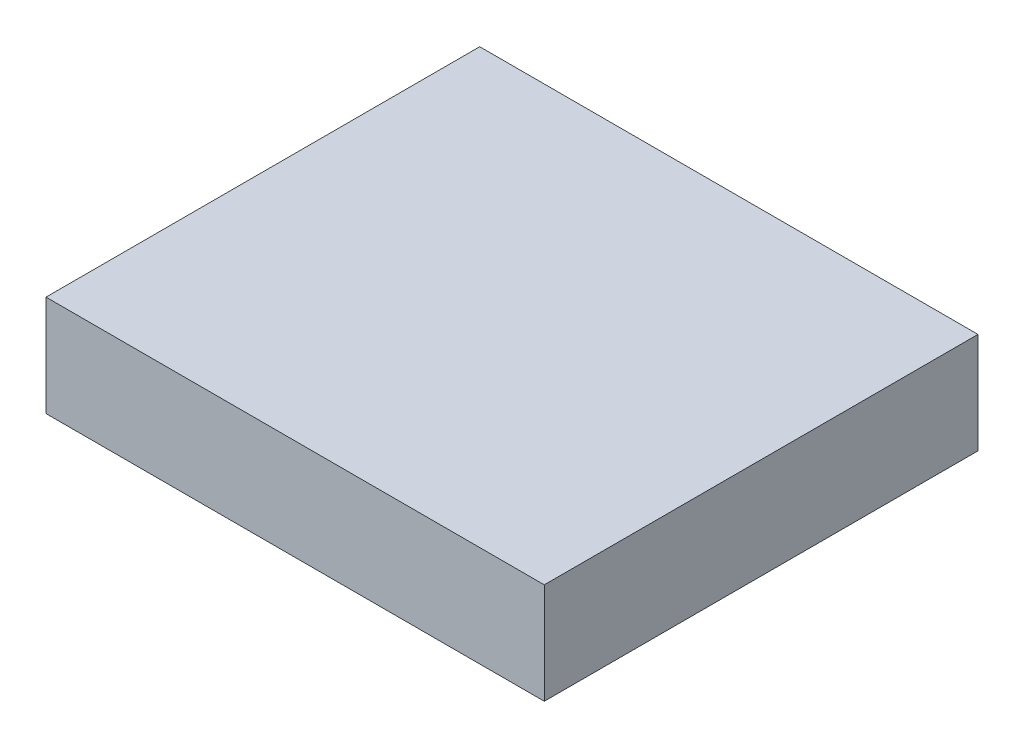
ISO-10303-21;
HEADER;
FILE_DESCRIPTION(('STEP AP214'),'2;1');
FILE_NAME('part.step','',(''),(''),'','','');
FILE_SCHEMA(('AUTOMOTIVE_DESIGN { 1 0 10303 214 1 1 1 1 }'));
ENDSEC;
DATA;
#1=APPLICATION_CONTEXT('core data for automotive mechanical design processes');
#2=APPLICATION_PROTOCOL_DEFINITION('international standard','automotive_design',2000,#1);
#3=PRODUCT_CONTEXT('',#1,'mechanical');
#4=PRODUCT('Part','Part','',(#3));
#5=PRODUCT_RELATED_PRODUCT_CATEGORY('part','',(#4));
#6=PRODUCT_DEFINITION_FORMATION('','',#4);
#7=PRODUCT_DEFINITION_CONTEXT('part definition',#1,'design');
#8=PRODUCT_DEFINITION('design','',#6,#7);
#9=PRODUCT_DEFINITION_SHAPE('','',#8);
#10=(LENGTH_UNIT() NAMED_UNIT(*) SI_UNIT(.MILLI.,.METRE.));
#11=(NAMED_UNIT(*) PLANE_ANGLE_UNIT() SI_UNIT($,.RADIAN.));
#12=(NAMED_UNIT(*) SI_UNIT($,.STERADIAN.) SOLID_ANGLE_UNIT());
#13=UNCERTAINTY_MEASURE_WITH_UNIT(LENGTH_MEASURE(1.E-05),#10,'distance_accuracy_value','');
#14=(GEOMETRIC_REPRESENTATION_CONTEXT(3) GLOBAL_UNCERTAINTY_ASSIGNED_CONTEXT((#13)) GLOBAL_UNIT_ASSIGNED_CONTEXT((#10,
#11,#12)) REPRESENTATION_CONTEXT('',''));
#15=CARTESIAN_POINT('',(0.,0.,0.));
#16=DIRECTION('',(0.,0.,1.));
#17=DIRECTION('',(1.,0.,0.));
#18=AXIS2_PLACEMENT_3D('',#15,#16,#17);
#19=CARTESIAN_POINT('',(0.,5.,0.));
#20=DIRECTION('',(1.,0.,0.));
#21=DIRECTION('',(0.,0.,-1.));
#22=AXIS2_PLACEMENT_3D('',#19,#20,#21);
#23=PLANE('',#22);
#24=DIRECTION('',(0.,0.,1.));
#25=VECTOR('',#24,1.);
#26=CARTESIAN_POINT('',(0.,0.,0.));
#27=LINE('',#26,#25);
#28=CARTESIAN_POINT('',(0.,0.,0.));
#29=VERTEX_POINT('',#28);
#30=CARTESIAN_POINT('',(0.,0.,21.5));
#31=VERTEX_POINT('',#30);
#32=EDGE_CURVE('E96',#29,#31,#27,.T.);
#33=ORIENTED_EDGE('',*,*,#32,.T.);
#34=DIRECTION('',(0.,-1.,0.));
#35=VECTOR('',#34,1.);
#36=CARTESIAN_POINT('',(0.,5.,21.5));
#37=LINE('',#36,#35);
#38=CARTESIAN_POINT('',(0.,5.,21.5));
#39=VERTEX_POINT('',#38);
#40=EDGE_CURVE('E11',#39,#31,#37,.T.);
#41=ORIENTED_EDGE('',*,*,#40,.F.);
#42=DIRECTION('',(0.,0.,1.));
#43=VECTOR('',#42,1.);
#44=CARTESIAN_POINT('',(0.,5.,0.));
#45=LINE('',#44,#43);
#46=CARTESIAN_POINT('',(0.,5.,0.));
#47=VERTEX_POINT('',#46);
#48=EDGE_CURVE('E84',#47,#39,#45,.T.);
#49=ORIENTED_EDGE('',*,*,#48,.F.);
#50=DIRECTION('',(0.,-1.,0.));
#51=VECTOR('',#50,1.);
#52=CARTESIAN_POINT('',(0.,5.,0.));
#53=LINE('',#52,#51);
#54=EDGE_CURVE('E92',#47,#29,#53,.T.);
#55=ORIENTED_EDGE('',*,*,#54,.T.);
#56=EDGE_LOOP('',(#33,#41,#49,#55));
#57=FACE_BOUND('',#56,.T.);
#58=ADVANCED_FACE('F33',(#57),#23,.F.);
#59=CARTESIAN_POINT('',(0.,5.,21.5));
#60=DIRECTION('',(0.,0.,-1.));
#61=DIRECTION('',(-1.,0.,0.));
#62=AXIS2_PLACEMENT_3D('',#59,#60,#61);
#63=PLANE('',#62);
#64=DIRECTION('',(1.,0.,0.));
#65=VECTOR('',#64,1.);
#66=CARTESIAN_POINT('',(0.,0.,21.5));
#67=LINE('',#66,#65);
#68=CARTESIAN_POINT('',(24.7,0.,21.5));
#69=VERTEX_POINT('',#68);
#70=EDGE_CURVE('E88',#31,#69,#67,.T.);
#71=ORIENTED_EDGE('',*,*,#70,.T.);
#72=DIRECTION('',(0.,-1.,0.));
#73=VECTOR('',#72,1.);
#74=CARTESIAN_POINT('',(24.7,5.,21.5));
#75=LINE('',#74,#73);
#76=CARTESIAN_POINT('',(24.7,5.,21.5));
#77=VERTEX_POINT('',#76);
#78=EDGE_CURVE('E41',#77,#69,#75,.T.);
#79=ORIENTED_EDGE('',*,*,#78,.F.);
#80=DIRECTION('',(1.,0.,0.));
#81=VECTOR('',#80,1.);
#82=CARTESIAN_POINT('',(0.,5.,21.5));
#83=LINE('',#82,#81);
#84=EDGE_CURVE('E79',#39,#77,#83,.T.);
#85=ORIENTED_EDGE('',*,*,#84,.F.);
#86=ORIENTED_EDGE('',*,*,#40,.T.);
#87=EDGE_LOOP('',(#71,#79,#85,#86));
#88=FACE_BOUND('',#87,.T.);
#89=ADVANCED_FACE('F87',(#88),#63,.F.);
#90=CARTESIAN_POINT('',(24.7,5.,0.));
#91=DIRECTION('',(-1.,0.,0.));
#92=DIRECTION('',(0.,0.,1.));
#93=AXIS2_PLACEMENT_3D('',#90,#91,#92);
#94=PLANE('',#93);
#95=DIRECTION('',(0.,0.,-1.));
#96=VECTOR('',#95,1.);
#97=CARTESIAN_POINT('',(24.7,0.,0.));
#98=LINE('',#97,#96);
#99=CARTESIAN_POINT('',(24.7,0.,0.));
#100=VERTEX_POINT('',#99);
#101=EDGE_CURVE('E66',#69,#100,#98,.T.);
#102=ORIENTED_EDGE('',*,*,#101,.T.);
#103=DIRECTION('',(0.,-1.,0.));
#104=VECTOR('',#103,1.);
#105=CARTESIAN_POINT('',(24.7,5.,0.));
#106=LINE('',#105,#104);
#107=CARTESIAN_POINT('',(24.7,5.,0.));
#108=VERTEX_POINT('',#107);
#109=EDGE_CURVE('E89',#108,#100,#106,.T.);
#110=ORIENTED_EDGE('',*,*,#109,.F.);
#111=DIRECTION('',(0.,0.,-1.));
#112=VECTOR('',#111,1.);
#113=CARTESIAN_POINT('',(24.7,5.,0.));
#114=LINE('',#113,#112);
#115=EDGE_CURVE('E82',#77,#108,#114,.T.);
#116=ORIENTED_EDGE('',*,*,#115,.F.);
#117=ORIENTED_EDGE('',*,*,#78,.T.);
#118=EDGE_LOOP('',(#102,#110,#116,#117));
#119=FACE_BOUND('',#118,.T.);
#120=ADVANCED_FACE('F90',(#119),#94,.F.);
#121=CARTESIAN_POINT('',(0.,5.,0.));
#122=DIRECTION('',(0.,0.,1.));
#123=DIRECTION('',(1.,0.,0.));
#124=AXIS2_PLACEMENT_3D('',#121,#122,#123);
#125=PLANE('',#124);
#126=DIRECTION('',(-1.,0.,0.));
#127=VECTOR('',#126,1.);
#128=CARTESIAN_POINT('',(0.,0.,0.));
#129=LINE('',#128,#127);
#130=EDGE_CURVE('E72',#100,#29,#129,.T.);
#131=ORIENTED_EDGE('',*,*,#130,.T.);
#132=ORIENTED_EDGE('',*,*,#54,.F.);
#133=DIRECTION('',(-1.,0.,0.));
#134=VECTOR('',#133,1.);
#135=CARTESIAN_POINT('',(0.,5.,0.));
#136=LINE('',#135,#134);
#137=EDGE_CURVE('E49',#108,#47,#136,.T.);
#138=ORIENTED_EDGE('',*,*,#137,.F.);
#139=ORIENTED_EDGE('',*,*,#109,.T.);
#140=EDGE_LOOP('',(#131,#132,#138,#139));
#141=FACE_BOUND('',#140,.T.);
#142=ADVANCED_FACE('F103',(#141),#125,.F.);
#143=CARTESIAN_POINT('',(0.,5.,0.));
#144=DIRECTION('',(0.,1.,0.));
#145=DIRECTION('',(0.,0.,1.));
#146=AXIS2_PLACEMENT_3D('',#143,#144,#145);
#147=PLANE('',#146);
#148=ORIENTED_EDGE('',*,*,#48,.T.);
#149=ORIENTED_EDGE('',*,*,#84,.T.);
#150=ORIENTED_EDGE('',*,*,#115,.T.);
#151=ORIENTED_EDGE('',*,*,#137,.T.);
#152=EDGE_LOOP('',(#148,#149,#150,#151));
#153=FACE_BOUND('',#152,.T.);
#154=ADVANCED_FACE('F80',(#153),#147,.T.);
#155=CARTESIAN_POINT('',(0.,0.,0.));
#156=DIRECTION('',(0.,1.,0.));
#157=DIRECTION('',(0.,0.,1.));
#158=AXIS2_PLACEMENT_3D('',#155,#156,#157);
#159=PLANE('',#158);
#160=ORIENTED_EDGE('',*,*,#32,.F.);
#161=ORIENTED_EDGE('',*,*,#130,.F.);
#162=ORIENTED_EDGE('',*,*,#101,.F.);
#163=ORIENTED_EDGE('',*,*,#70,.F.);
#164=EDGE_LOOP('',(#160,#161,#162,#163));
#165=FACE_BOUND('',#164,.T.);
#166=ADVANCED_FACE('F106',(#165),#159,.F.);
#167=CLOSED_SHELL('',(#58,#89,#120,#142,#154,#166));
#168=MANIFOLD_SOLID_BREP('B2',#167);
#169=ADVANCED_BREP_SHAPE_REPRESENTATION('',(#18,#168),#14);
#170=SHAPE_DEFINITION_REPRESENTATION(#9,#169);
ENDSEC;
END-ISO-10303-21;
